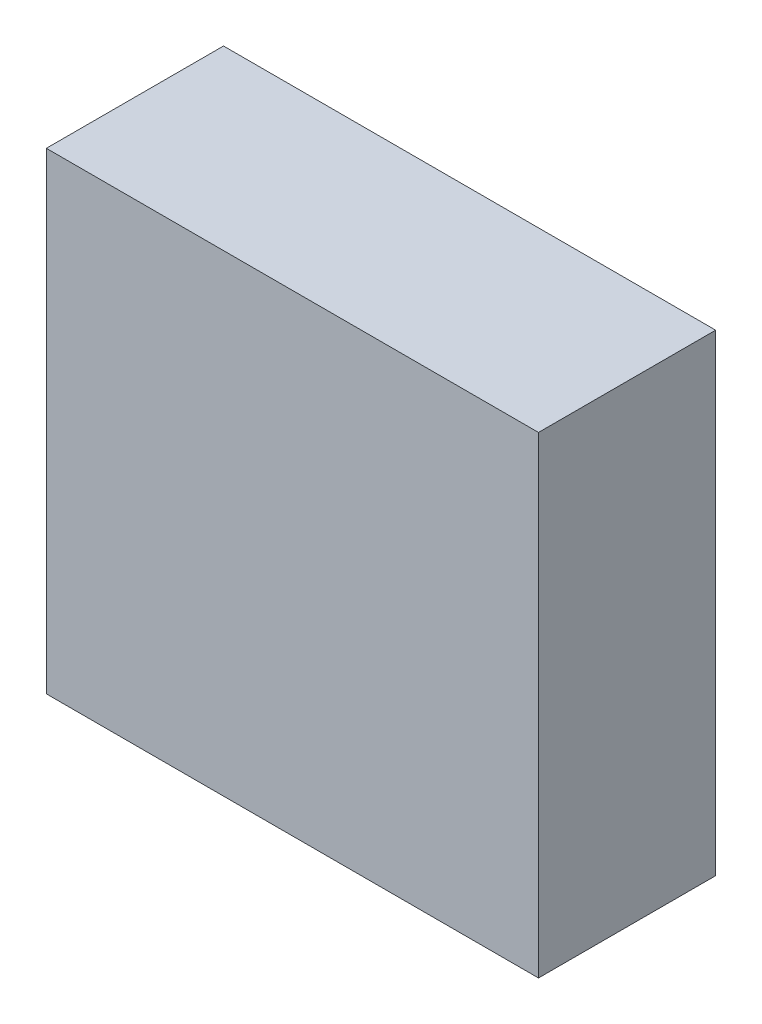
ISO-10303-21;
HEADER;
FILE_DESCRIPTION(('STEP AP214'),'2;1');
FILE_NAME('part.step','',(''),(''),'','','');
FILE_SCHEMA(('AUTOMOTIVE_DESIGN { 1 0 10303 214 1 1 1 1 }'));
ENDSEC;
DATA;
#1=APPLICATION_CONTEXT('core data for automotive mechanical design processes');
#2=APPLICATION_PROTOCOL_DEFINITION('international standard','automotive_design',2000,#1);
#3=PRODUCT_CONTEXT('',#1,'mechanical');
#4=PRODUCT('Part','Part','',(#3));
#5=PRODUCT_RELATED_PRODUCT_CATEGORY('part','',(#4));
#6=PRODUCT_DEFINITION_FORMATION('','',#4);
#7=PRODUCT_DEFINITION_CONTEXT('part definition',#1,'design');
#8=PRODUCT_DEFINITION('design','',#6,#7);
#9=PRODUCT_DEFINITION_SHAPE('','',#8);
#10=(LENGTH_UNIT() NAMED_UNIT(*) SI_UNIT(.MILLI.,.METRE.));
#11=(NAMED_UNIT(*) PLANE_ANGLE_UNIT() SI_UNIT($,.RADIAN.));
#12=(NAMED_UNIT(*) SI_UNIT($,.STERADIAN.) SOLID_ANGLE_UNIT());
#13=UNCERTAINTY_MEASURE_WITH_UNIT(LENGTH_MEASURE(1.E-05),#10,'distance_accuracy_value','');
#14=(GEOMETRIC_REPRESENTATION_CONTEXT(3) GLOBAL_UNCERTAINTY_ASSIGNED_CONTEXT((#13)) GLOBAL_UNIT_ASSIGNED_CONTEXT((#10,
#11,#12)) REPRESENTATION_CONTEXT('',''));
#15=CARTESIAN_POINT('',(0.,0.,0.));
#16=DIRECTION('',(0.,0.,1.));
#17=DIRECTION('',(1.,0.,0.));
#18=AXIS2_PLACEMENT_3D('',#15,#16,#17);
#19=CARTESIAN_POINT('',(-12.5,-12.,9.));
#20=DIRECTION('',(1.,0.,0.));
#21=DIRECTION('',(0.,0.,-1.));
#22=AXIS2_PLACEMENT_3D('',#19,#20,#21);
#23=PLANE('',#22);
#24=DIRECTION('',(0.,-1.,0.));
#25=VECTOR('',#24,1.);
#26=CARTESIAN_POINT('',(-12.5,-12.,0.));
#27=LINE('',#26,#25);
#28=CARTESIAN_POINT('',(-12.5,12.,0.));
#29=VERTEX_POINT('',#28);
#30=CARTESIAN_POINT('',(-12.5,-12.,0.));
#31=VERTEX_POINT('',#30);
#32=EDGE_CURVE('E107',#29,#31,#27,.T.);
#33=ORIENTED_EDGE('',*,*,#32,.T.);
#34=DIRECTION('',(0.,0.,-1.));
#35=VECTOR('',#34,1.);
#36=CARTESIAN_POINT('',(-12.5,-12.,9.));
#37=LINE('',#36,#35);
#38=CARTESIAN_POINT('',(-12.5,-12.,9.));
#39=VERTEX_POINT('',#38);
#40=EDGE_CURVE('E11',#39,#31,#37,.T.);
#41=ORIENTED_EDGE('',*,*,#40,.F.);
#42=DIRECTION('',(0.,-1.,0.));
#43=VECTOR('',#42,1.);
#44=CARTESIAN_POINT('',(-12.5,-12.,9.));
#45=LINE('',#44,#43);
#46=CARTESIAN_POINT('',(-12.5,12.,9.));
#47=VERTEX_POINT('',#46);
#48=EDGE_CURVE('E91',#47,#39,#45,.T.);
#49=ORIENTED_EDGE('',*,*,#48,.F.);
#50=DIRECTION('',(0.,0.,-1.));
#51=VECTOR('',#50,1.);
#52=CARTESIAN_POINT('',(-12.5,12.,9.));
#53=LINE('',#52,#51);
#54=EDGE_CURVE('E103',#47,#29,#53,.T.);
#55=ORIENTED_EDGE('',*,*,#54,.T.);
#56=EDGE_LOOP('',(#33,#41,#49,#55));
#57=FACE_BOUND('',#56,.T.);
#58=ADVANCED_FACE('F39',(#57),#23,.F.);
#59=CARTESIAN_POINT('',(12.5,-12.,9.));
#60=DIRECTION('',(0.,1.,0.));
#61=DIRECTION('',(-1.,0.,0.));
#62=AXIS2_PLACEMENT_3D('',#59,#60,#61);
#63=PLANE('',#62);
#64=DIRECTION('',(1.,0.,0.));
#65=VECTOR('',#64,1.);
#66=CARTESIAN_POINT('',(12.5,-12.,0.));
#67=LINE('',#66,#65);
#68=CARTESIAN_POINT('',(12.5,-12.,0.));
#69=VERTEX_POINT('',#68);
#70=EDGE_CURVE('E96',#31,#69,#67,.T.);
#71=ORIENTED_EDGE('',*,*,#70,.T.);
#72=DIRECTION('',(0.,0.,-1.));
#73=VECTOR('',#72,1.);
#74=CARTESIAN_POINT('',(12.5,-12.,9.));
#75=LINE('',#74,#73);
#76=CARTESIAN_POINT('',(12.5,-12.,9.));
#77=VERTEX_POINT('',#76);
#78=EDGE_CURVE('E48',#77,#69,#75,.T.);
#79=ORIENTED_EDGE('',*,*,#78,.F.);
#80=DIRECTION('',(1.,0.,0.));
#81=VECTOR('',#80,1.);
#82=CARTESIAN_POINT('',(12.5,-12.,9.));
#83=LINE('',#82,#81);
#84=EDGE_CURVE('E86',#39,#77,#83,.T.);
#85=ORIENTED_EDGE('',*,*,#84,.F.);
#86=ORIENTED_EDGE('',*,*,#40,.T.);
#87=EDGE_LOOP('',(#71,#79,#85,#86));
#88=FACE_BOUND('',#87,.T.);
#89=ADVANCED_FACE('F95',(#88),#63,.F.);
#90=CARTESIAN_POINT('',(12.5,-12.,9.));
#91=DIRECTION('',(-1.,0.,0.));
#92=DIRECTION('',(0.,0.,1.));
#93=AXIS2_PLACEMENT_3D('',#90,#91,#92);
#94=PLANE('',#93);
#95=DIRECTION('',(0.,1.,0.));
#96=VECTOR('',#95,1.);
#97=CARTESIAN_POINT('',(12.5,-12.,0.));
#98=LINE('',#97,#96);
#99=CARTESIAN_POINT('',(12.5,12.,0.));
#100=VERTEX_POINT('',#99);
#101=EDGE_CURVE('E73',#69,#100,#98,.T.);
#102=ORIENTED_EDGE('',*,*,#101,.T.);
#103=DIRECTION('',(0.,0.,-1.));
#104=VECTOR('',#103,1.);
#105=CARTESIAN_POINT('',(12.5,12.,9.));
#106=LINE('',#105,#104);
#107=CARTESIAN_POINT('',(12.5,12.,9.));
#108=VERTEX_POINT('',#107);
#109=EDGE_CURVE('E98',#108,#100,#106,.T.);
#110=ORIENTED_EDGE('',*,*,#109,.F.);
#111=DIRECTION('',(0.,1.,0.));
#112=VECTOR('',#111,1.);
#113=CARTESIAN_POINT('',(12.5,-12.,9.));
#114=LINE('',#113,#112);
#115=EDGE_CURVE('E89',#77,#108,#114,.T.);
#116=ORIENTED_EDGE('',*,*,#115,.F.);
#117=ORIENTED_EDGE('',*,*,#78,.T.);
#118=EDGE_LOOP('',(#102,#110,#116,#117));
#119=FACE_BOUND('',#118,.T.);
#120=ADVANCED_FACE('F99',(#119),#94,.F.);
#121=CARTESIAN_POINT('',(12.5,12.,9.));
#122=DIRECTION('',(0.,-1.,0.));
#123=DIRECTION('',(1.,0.,0.));
#124=AXIS2_PLACEMENT_3D('',#121,#122,#123);
#125=PLANE('',#124);
#126=DIRECTION('',(-1.,0.,0.));
#127=VECTOR('',#126,1.);
#128=CARTESIAN_POINT('',(12.5,12.,0.));
#129=LINE('',#128,#127);
#130=EDGE_CURVE('E79',#100,#29,#129,.T.);
#131=ORIENTED_EDGE('',*,*,#130,.T.);
#132=ORIENTED_EDGE('',*,*,#54,.F.);
#133=DIRECTION('',(-1.,0.,0.));
#134=VECTOR('',#133,1.);
#135=CARTESIAN_POINT('',(12.5,12.,9.));
#136=LINE('',#135,#134);
#137=EDGE_CURVE('E56',#108,#47,#136,.T.);
#138=ORIENTED_EDGE('',*,*,#137,.F.);
#139=ORIENTED_EDGE('',*,*,#109,.T.);
#140=EDGE_LOOP('',(#131,#132,#138,#139));
#141=FACE_BOUND('',#140,.T.);
#142=ADVANCED_FACE('F120',(#141),#125,.F.);
#143=CARTESIAN_POINT('',(0.,0.,9.));
#144=DIRECTION('',(0.,0.,1.));
#145=DIRECTION('',(1.,0.,0.));
#146=AXIS2_PLACEMENT_3D('',#143,#144,#145);
#147=PLANE('',#146);
#148=ORIENTED_EDGE('',*,*,#48,.T.);
#149=ORIENTED_EDGE('',*,*,#84,.T.);
#150=ORIENTED_EDGE('',*,*,#115,.T.);
#151=ORIENTED_EDGE('',*,*,#137,.T.);
#152=EDGE_LOOP('',(#148,#149,#150,#151));
#153=FACE_BOUND('',#152,.T.);
#154=ADVANCED_FACE('F87',(#153),#147,.T.);
#155=CARTESIAN_POINT('',(0.,0.,0.));
#156=DIRECTION('',(0.,0.,1.));
#157=DIRECTION('',(1.,0.,0.));
#158=AXIS2_PLACEMENT_3D('',#155,#156,#157);
#159=PLANE('',#158);
#160=ORIENTED_EDGE('',*,*,#32,.F.);
#161=ORIENTED_EDGE('',*,*,#130,.F.);
#162=ORIENTED_EDGE('',*,*,#101,.F.);
#163=ORIENTED_EDGE('',*,*,#70,.F.);
#164=EDGE_LOOP('',(#160,#161,#162,#163));
#165=FACE_BOUND('',#164,.T.);
#166=ADVANCED_FACE('F123',(#165),#159,.F.);
#167=CLOSED_SHELL('',(#58,#89,#120,#142,#154,#166));
#168=MANIFOLD_SOLID_BREP('B2',#167);
#169=ADVANCED_BREP_SHAPE_REPRESENTATION('',(#18,#168),#14);
#170=SHAPE_DEFINITION_REPRESENTATION(#9,#169);
ENDSEC;
END-ISO-10303-21;
